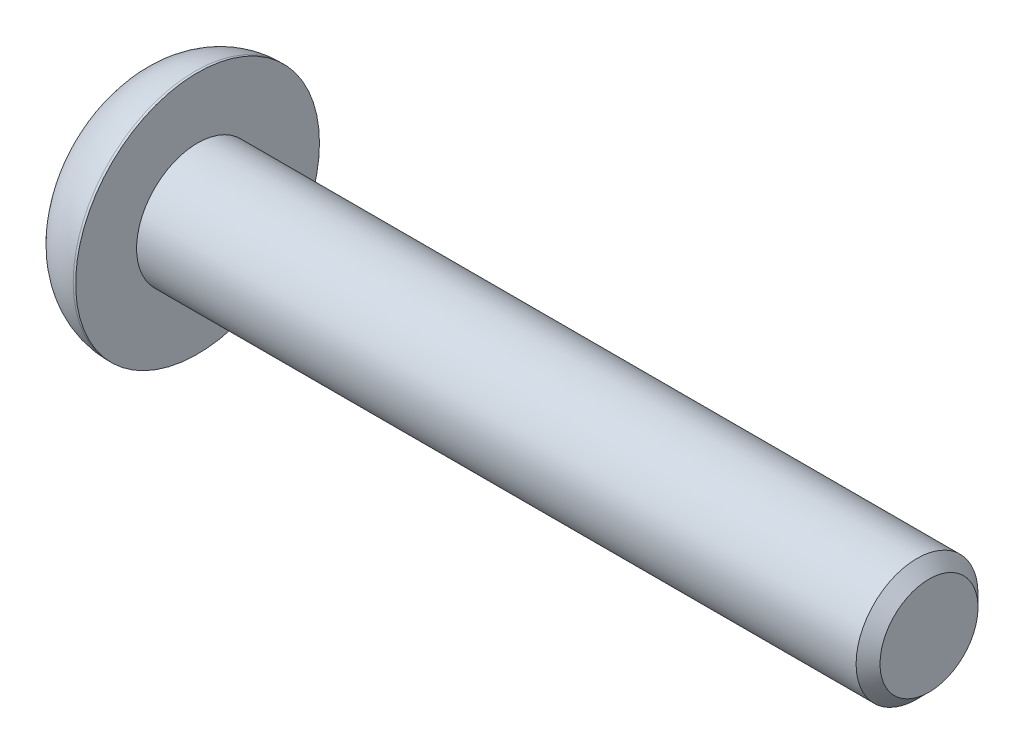
ISO-10303-21;
HEADER;
FILE_DESCRIPTION(('STEP AP214'),'2;1');
FILE_NAME('part.step','',(''),(''),'','','');
FILE_SCHEMA(('AUTOMOTIVE_DESIGN { 1 0 10303 214 1 1 1 1 }'));
ENDSEC;
DATA;
#1=APPLICATION_CONTEXT('core data for automotive mechanical design processes');
#2=APPLICATION_PROTOCOL_DEFINITION('international standard','automotive_design',2000,#1);
#3=PRODUCT_CONTEXT('',#1,'mechanical');
#4=PRODUCT('Part','Part','',(#3));
#5=PRODUCT_RELATED_PRODUCT_CATEGORY('part','',(#4));
#6=PRODUCT_DEFINITION_FORMATION('','',#4);
#7=PRODUCT_DEFINITION_CONTEXT('part definition',#1,'design');
#8=PRODUCT_DEFINITION('design','',#6,#7);
#9=PRODUCT_DEFINITION_SHAPE('','',#8);
#10=(LENGTH_UNIT() NAMED_UNIT(*) SI_UNIT(.MILLI.,.METRE.));
#11=(NAMED_UNIT(*) PLANE_ANGLE_UNIT() SI_UNIT($,.RADIAN.));
#12=(NAMED_UNIT(*) SI_UNIT($,.STERADIAN.) SOLID_ANGLE_UNIT());
#13=UNCERTAINTY_MEASURE_WITH_UNIT(LENGTH_MEASURE(1.E-05),#10,'distance_accuracy_value','');
#14=(GEOMETRIC_REPRESENTATION_CONTEXT(3) GLOBAL_UNCERTAINTY_ASSIGNED_CONTEXT((#13)) GLOBAL_UNIT_ASSIGNED_CONTEXT((#10,
#11,#12)) REPRESENTATION_CONTEXT('',''));
#15=CARTESIAN_POINT('',(0.,0.,0.));
#16=DIRECTION('',(0.,0.,1.));
#17=DIRECTION('',(1.,0.,0.));
#18=AXIS2_PLACEMENT_3D('',#15,#16,#17);
#19=CARTESIAN_POINT('',(1.93397459628386,0.,0.));
#20=DIRECTION('',(-1.,0.,0.));
#21=DIRECTION('',(0.,0.,1.));
#22=AXIS2_PLACEMENT_3D('',#19,#20,#21);
#23=CONICAL_SURFACE('',#22,1.499999999794,1.04719755099793);
#24=CARTESIAN_POINT('',(2.79999999995084,3.41060513164848E-10,0.));
#25=VERTEX_POINT('',#24);
#26=VERTEX_LOOP('',#25);
#27=FACE_BOUND('',#26,.T.);
#28=CARTESIAN_POINT('',(1.93397459621556,0.,0.));
#29=DIRECTION('',(1.,0.,0.));
#30=DIRECTION('',(0.,0.,-1.));
#31=AXIS2_PLACEMENT_3D('',#28,#29,#30);
#32=CIRCLE('',#31,1.5);
#33=CARTESIAN_POINT('',(1.93397459621556,0.,-1.5));
#34=VERTEX_POINT('',#33);
#35=EDGE_CURVE('E120',#34,#34,#32,.F.);
#36=ORIENTED_EDGE('',*,*,#35,.T.);
#37=EDGE_LOOP('',(#36));
#38=FACE_BOUND('',#37,.T.);
#39=ADVANCED_FACE('F16',(#27,#38),#23,.F.);
#40=CARTESIAN_POINT('',(0.966987298107781,0.,0.));
#41=DIRECTION('',(1.,0.,0.));
#42=DIRECTION('',(0.,0.,-1.));
#43=AXIS2_PLACEMENT_3D('',#40,#41,#42);
#44=CYLINDRICAL_SURFACE('',#43,1.5);
#45=ORIENTED_EDGE('',*,*,#35,.F.);
#46=EDGE_LOOP('',(#45));
#47=FACE_BOUND('',#46,.T.);
#48=CARTESIAN_POINT('',(1.82,0.,0.));
#49=DIRECTION('',(1.,0.,0.));
#50=DIRECTION('',(0.,0.,-1.));
#51=AXIS2_PLACEMENT_3D('',#48,#49,#50);
#52=CIRCLE('',#51,1.5);
#53=CARTESIAN_POINT('',(1.82,1.29903810567666,-0.75));
#54=VERTEX_POINT('',#53);
#55=CARTESIAN_POINT('',(1.82,1.29903810567666,0.749999999999999));
#56=VERTEX_POINT('',#55);
#57=EDGE_CURVE('E93',#54,#56,#52,.T.);
#58=ORIENTED_EDGE('',*,*,#57,.F.);
#59=CARTESIAN_POINT('',(1.82,0.,0.));
#60=DIRECTION('',(1.,0.,0.));
#61=DIRECTION('',(0.,0.,-1.));
#62=AXIS2_PLACEMENT_3D('',#59,#60,#61);
#63=CIRCLE('',#62,1.5);
#64=CARTESIAN_POINT('',(1.82,0.,-1.5));
#65=VERTEX_POINT('',#64);
#66=EDGE_CURVE('E101',#65,#54,#63,.T.);
#67=ORIENTED_EDGE('',*,*,#66,.F.);
#68=CARTESIAN_POINT('',(1.82,0.,0.));
#69=DIRECTION('',(1.,0.,0.));
#70=DIRECTION('',(0.,0.,-1.));
#71=AXIS2_PLACEMENT_3D('',#68,#69,#70);
#72=CIRCLE('',#71,1.5);
#73=CARTESIAN_POINT('',(1.82,-1.29903810567666,-0.749999999999999));
#74=VERTEX_POINT('',#73);
#75=EDGE_CURVE('E130',#65,#74,#72,.F.);
#76=ORIENTED_EDGE('',*,*,#75,.T.);
#77=CARTESIAN_POINT('',(1.82,0.,0.));
#78=DIRECTION('',(1.,0.,0.));
#79=DIRECTION('',(0.,0.,-1.));
#80=AXIS2_PLACEMENT_3D('',#77,#78,#79);
#81=CIRCLE('',#80,1.5);
#82=CARTESIAN_POINT('',(1.82,-1.29903810567666,0.750000000000001));
#83=VERTEX_POINT('',#82);
#84=EDGE_CURVE('E100',#74,#83,#81,.F.);
#85=ORIENTED_EDGE('',*,*,#84,.T.);
#86=CARTESIAN_POINT('',(1.82,0.,0.));
#87=DIRECTION('',(1.,0.,0.));
#88=DIRECTION('',(0.,0.,-1.));
#89=AXIS2_PLACEMENT_3D('',#86,#87,#88);
#90=CIRCLE('',#89,1.5);
#91=CARTESIAN_POINT('',(1.82,0.,1.5));
#92=VERTEX_POINT('',#91);
#93=EDGE_CURVE('E119',#92,#83,#90,.T.);
#94=ORIENTED_EDGE('',*,*,#93,.F.);
#95=CARTESIAN_POINT('',(1.82,0.,0.));
#96=DIRECTION('',(1.,0.,0.));
#97=DIRECTION('',(0.,0.,-1.));
#98=AXIS2_PLACEMENT_3D('',#95,#96,#97);
#99=CIRCLE('',#98,1.5);
#100=EDGE_CURVE('E19',#56,#92,#99,.T.);
#101=ORIENTED_EDGE('',*,*,#100,.F.);
#102=EDGE_LOOP('',(#58,#67,#76,#85,#94,#101));
#103=FACE_BOUND('',#102,.T.);
#104=ADVANCED_FACE('F117',(#47,#103),#44,.F.);
#105=CARTESIAN_POINT('',(1.82,0.,0.));
#106=DIRECTION('',(1.,0.,0.));
#107=DIRECTION('',(0.,0.,-1.));
#108=AXIS2_PLACEMENT_3D('',#105,#106,#107);
#109=PLANE('',#108);
#110=DIRECTION('',(0.,0.5,-0.866025403784439));
#111=VECTOR('',#110,1.);
#112=CARTESIAN_POINT('',(1.82,-0.866025403784439,-1.5));
#113=LINE('',#112,#111);
#114=CARTESIAN_POINT('',(1.82,-1.73205080756888,0.));
#115=VERTEX_POINT('',#114);
#116=EDGE_CURVE('E152',#74,#115,#113,.F.);
#117=ORIENTED_EDGE('',*,*,#116,.T.);
#118=DIRECTION('',(0.,-0.5,-0.866025403784439));
#119=VECTOR('',#118,1.);
#120=CARTESIAN_POINT('',(1.82,-1.73205080756888,0.));
#121=LINE('',#120,#119);
#122=EDGE_CURVE('E163',#115,#83,#121,.F.);
#123=ORIENTED_EDGE('',*,*,#122,.T.);
#124=ORIENTED_EDGE('',*,*,#84,.F.);
#125=EDGE_LOOP('',(#117,#123,#124));
#126=FACE_BOUND('',#125,.T.);
#127=ADVANCED_FACE('F414',(#126),#109,.F.);
#128=CARTESIAN_POINT('',(1.82,0.,0.));
#129=DIRECTION('',(1.,0.,0.));
#130=DIRECTION('',(0.,0.,-1.));
#131=AXIS2_PLACEMENT_3D('',#128,#129,#130);
#132=PLANE('',#131);
#133=DIRECTION('',(0.,1.,0.));
#134=VECTOR('',#133,1.);
#135=CARTESIAN_POINT('',(1.82,0.866025403784439,-1.5));
#136=LINE('',#135,#134);
#137=CARTESIAN_POINT('',(1.82,-0.866025403784439,-1.5));
#138=VERTEX_POINT('',#137);
#139=EDGE_CURVE('E173',#65,#138,#136,.F.);
#140=ORIENTED_EDGE('',*,*,#139,.T.);
#141=DIRECTION('',(0.,0.5,-0.866025403784439));
#142=VECTOR('',#141,1.);
#143=CARTESIAN_POINT('',(1.82,-0.866025403784439,-1.5));
#144=LINE('',#143,#142);
#145=EDGE_CURVE('E132',#138,#74,#144,.F.);
#146=ORIENTED_EDGE('',*,*,#145,.T.);
#147=ORIENTED_EDGE('',*,*,#75,.F.);
#148=EDGE_LOOP('',(#140,#146,#147));
#149=FACE_BOUND('',#148,.T.);
#150=ADVANCED_FACE('F404',(#149),#132,.F.);
#151=CARTESIAN_POINT('',(0.,-0.866025403784439,-1.5));
#152=DIRECTION('',(0.,-0.866025403784439,-0.5));
#153=DIRECTION('',(0.,0.5,-0.866025403784439));
#154=AXIS2_PLACEMENT_3D('',#151,#152,#153);
#155=PLANE('',#154);
#156=DIRECTION('',(1.,0.,0.));
#157=VECTOR('',#156,1.);
#158=CARTESIAN_POINT('',(0.,-1.73205080756888,0.));
#159=LINE('',#158,#157);
#160=CARTESIAN_POINT('',(0.,-1.73205080756888,0.));
#161=VERTEX_POINT('',#160);
#162=EDGE_CURVE('E158',#161,#115,#159,.T.);
#163=ORIENTED_EDGE('',*,*,#162,.T.);
#164=ORIENTED_EDGE('',*,*,#116,.F.);
#165=ORIENTED_EDGE('',*,*,#145,.F.);
#166=DIRECTION('',(-1.,0.,0.));
#167=VECTOR('',#166,1.);
#168=CARTESIAN_POINT('',(0.,-0.866025403784439,-1.5));
#169=LINE('',#168,#167);
#170=CARTESIAN_POINT('',(0.,-0.866025403784439,-1.5));
#171=VERTEX_POINT('',#170);
#172=EDGE_CURVE('E149',#138,#171,#169,.T.);
#173=ORIENTED_EDGE('',*,*,#172,.T.);
#174=DIRECTION('',(0.,0.5,-0.866025403784439));
#175=VECTOR('',#174,1.);
#176=CARTESIAN_POINT('',(0.,-0.866025403784439,-1.5));
#177=LINE('',#176,#175);
#178=EDGE_CURVE('E154',#161,#171,#177,.T.);
#179=ORIENTED_EDGE('',*,*,#178,.F.);
#180=EDGE_LOOP('',(#163,#164,#165,#173,#179));
#181=FACE_BOUND('',#180,.T.);
#182=ADVANCED_FACE('F394',(#181),#155,.F.);
#183=CARTESIAN_POINT('',(0.,-1.73205080756888,0.));
#184=DIRECTION('',(0.,-0.866025403784439,0.5));
#185=DIRECTION('',(0.,-0.5,-0.866025403784439));
#186=AXIS2_PLACEMENT_3D('',#183,#184,#185);
#187=PLANE('',#186);
#188=DIRECTION('',(1.,0.,0.));
#189=VECTOR('',#188,1.);
#190=CARTESIAN_POINT('',(0.,-0.866025403784439,1.5));
#191=LINE('',#190,#189);
#192=CARTESIAN_POINT('',(0.,-0.86602540378444,1.5));
#193=VERTEX_POINT('',#192);
#194=CARTESIAN_POINT('',(1.82,-0.866025403784439,1.5));
#195=VERTEX_POINT('',#194);
#196=EDGE_CURVE('E148',#193,#195,#191,.T.);
#197=ORIENTED_EDGE('',*,*,#196,.T.);
#198=DIRECTION('',(0.,-0.500000000000001,-0.866025403784438));
#199=VECTOR('',#198,1.);
#200=CARTESIAN_POINT('',(1.82,-0.866025403784439,1.5));
#201=LINE('',#200,#199);
#202=EDGE_CURVE('E186',#195,#83,#201,.T.);
#203=ORIENTED_EDGE('',*,*,#202,.T.);
#204=ORIENTED_EDGE('',*,*,#122,.F.);
#205=ORIENTED_EDGE('',*,*,#162,.F.);
#206=DIRECTION('',(0.,-0.5,-0.866025403784439));
#207=VECTOR('',#206,1.);
#208=CARTESIAN_POINT('',(0.,-1.73205080756888,0.));
#209=LINE('',#208,#207);
#210=EDGE_CURVE('E168',#193,#161,#209,.T.);
#211=ORIENTED_EDGE('',*,*,#210,.F.);
#212=EDGE_LOOP('',(#197,#203,#204,#205,#211));
#213=FACE_BOUND('',#212,.T.);
#214=ADVANCED_FACE('F385',(#213),#187,.F.);
#215=CARTESIAN_POINT('',(1.82,0.,0.));
#216=DIRECTION('',(1.,0.,0.));
#217=DIRECTION('',(0.,0.,-1.));
#218=AXIS2_PLACEMENT_3D('',#215,#216,#217);
#219=PLANE('',#218);
#220=ORIENTED_EDGE('',*,*,#202,.F.);
#221=DIRECTION('',(0.,1.,0.));
#222=VECTOR('',#221,1.);
#223=CARTESIAN_POINT('',(1.82,-0.866025403784439,1.5));
#224=LINE('',#223,#222);
#225=EDGE_CURVE('E193',#195,#92,#224,.T.);
#226=ORIENTED_EDGE('',*,*,#225,.T.);
#227=ORIENTED_EDGE('',*,*,#93,.T.);
#228=EDGE_LOOP('',(#220,#226,#227));
#229=FACE_BOUND('',#228,.T.);
#230=ADVANCED_FACE('F375',(#229),#219,.F.);
#231=CARTESIAN_POINT('',(1.82,0.,0.));
#232=DIRECTION('',(1.,0.,0.));
#233=DIRECTION('',(0.,0.,-1.));
#234=AXIS2_PLACEMENT_3D('',#231,#232,#233);
#235=PLANE('',#234);
#236=DIRECTION('',(0.,0.5,0.866025403784439));
#237=VECTOR('',#236,1.);
#238=CARTESIAN_POINT('',(1.82,1.73205080756888,0.));
#239=LINE('',#238,#237);
#240=CARTESIAN_POINT('',(1.82,0.866025403784441,-1.5));
#241=VERTEX_POINT('',#240);
#242=EDGE_CURVE('E203',#54,#241,#239,.F.);
#243=ORIENTED_EDGE('',*,*,#242,.T.);
#244=DIRECTION('',(0.,1.,0.));
#245=VECTOR('',#244,1.);
#246=CARTESIAN_POINT('',(1.82,0.866025403784439,-1.5));
#247=LINE('',#246,#245);
#248=EDGE_CURVE('E181',#241,#65,#247,.F.);
#249=ORIENTED_EDGE('',*,*,#248,.T.);
#250=ORIENTED_EDGE('',*,*,#66,.T.);
#251=EDGE_LOOP('',(#243,#249,#250));
#252=FACE_BOUND('',#251,.T.);
#253=ADVANCED_FACE('F365',(#252),#235,.F.);
#254=CARTESIAN_POINT('',(0.,0.866025403784439,-1.5));
#255=DIRECTION('',(0.,0.,-1.));
#256=DIRECTION('',(-1.,0.,0.));
#257=AXIS2_PLACEMENT_3D('',#254,#255,#256);
#258=PLANE('',#257);
#259=ORIENTED_EDGE('',*,*,#172,.F.);
#260=ORIENTED_EDGE('',*,*,#139,.F.);
#261=ORIENTED_EDGE('',*,*,#248,.F.);
#262=DIRECTION('',(1.,0.,0.));
#263=VECTOR('',#262,1.);
#264=CARTESIAN_POINT('',(0.,0.866025403784441,-1.5));
#265=LINE('',#264,#263);
#266=CARTESIAN_POINT('',(0.,0.86602540378444,-1.5));
#267=VERTEX_POINT('',#266);
#268=EDGE_CURVE('E200',#241,#267,#265,.F.);
#269=ORIENTED_EDGE('',*,*,#268,.T.);
#270=DIRECTION('',(0.,1.,0.));
#271=VECTOR('',#270,1.);
#272=CARTESIAN_POINT('',(0.,0.866025403784439,-1.5));
#273=LINE('',#272,#271);
#274=EDGE_CURVE('E146',#171,#267,#273,.T.);
#275=ORIENTED_EDGE('',*,*,#274,.F.);
#276=EDGE_LOOP('',(#259,#260,#261,#269,#275));
#277=FACE_BOUND('',#276,.T.);
#278=ADVANCED_FACE('F355',(#277),#258,.F.);
#279=CARTESIAN_POINT('',(0.,-0.866025403784439,1.5));
#280=DIRECTION('',(0.,0.,1.));
#281=DIRECTION('',(1.,0.,0.));
#282=AXIS2_PLACEMENT_3D('',#279,#280,#281);
#283=PLANE('',#282);
#284=DIRECTION('',(1.,0.,0.));
#285=VECTOR('',#284,1.);
#286=CARTESIAN_POINT('',(0.,0.866025403784439,1.5));
#287=LINE('',#286,#285);
#288=CARTESIAN_POINT('',(0.,0.866025403784439,1.5));
#289=VERTEX_POINT('',#288);
#290=CARTESIAN_POINT('',(1.82,0.866025403784439,1.5));
#291=VERTEX_POINT('',#290);
#292=EDGE_CURVE('E114',#289,#291,#287,.T.);
#293=ORIENTED_EDGE('',*,*,#292,.T.);
#294=DIRECTION('',(0.,1.,0.));
#295=VECTOR('',#294,1.);
#296=CARTESIAN_POINT('',(1.82,0.,1.5));
#297=LINE('',#296,#295);
#298=EDGE_CURVE('E113',#291,#92,#297,.F.);
#299=ORIENTED_EDGE('',*,*,#298,.T.);
#300=ORIENTED_EDGE('',*,*,#225,.F.);
#301=ORIENTED_EDGE('',*,*,#196,.F.);
#302=DIRECTION('',(0.,1.,0.));
#303=VECTOR('',#302,1.);
#304=CARTESIAN_POINT('',(0.,-0.866025403784439,1.5));
#305=LINE('',#304,#303);
#306=EDGE_CURVE('E197',#289,#193,#305,.F.);
#307=ORIENTED_EDGE('',*,*,#306,.F.);
#308=EDGE_LOOP('',(#293,#299,#300,#301,#307));
#309=FACE_BOUND('',#308,.T.);
#310=ADVANCED_FACE('F346',(#309),#283,.F.);
#311=CARTESIAN_POINT('',(1.82,0.,0.));
#312=DIRECTION('',(1.,0.,0.));
#313=DIRECTION('',(0.,0.,-1.));
#314=AXIS2_PLACEMENT_3D('',#311,#312,#313);
#315=PLANE('',#314);
#316=ORIENTED_EDGE('',*,*,#298,.F.);
#317=DIRECTION('',(0.,-0.5,0.866025403784439));
#318=VECTOR('',#317,1.);
#319=CARTESIAN_POINT('',(1.82,0.866025403784439,1.5));
#320=LINE('',#319,#318);
#321=EDGE_CURVE('E108',#291,#56,#320,.F.);
#322=ORIENTED_EDGE('',*,*,#321,.T.);
#323=ORIENTED_EDGE('',*,*,#100,.T.);
#324=EDGE_LOOP('',(#316,#322,#323));
#325=FACE_BOUND('',#324,.T.);
#326=ADVANCED_FACE('F112',(#325),#315,.F.);
#327=CARTESIAN_POINT('',(1.82,0.,0.));
#328=DIRECTION('',(1.,0.,0.));
#329=DIRECTION('',(0.,0.,-1.));
#330=AXIS2_PLACEMENT_3D('',#327,#328,#329);
#331=PLANE('',#330);
#332=DIRECTION('',(0.,-0.5,0.866025403784439));
#333=VECTOR('',#332,1.);
#334=CARTESIAN_POINT('',(1.82,0.866025403784439,1.5));
#335=LINE('',#334,#333);
#336=CARTESIAN_POINT('',(1.82,1.73205080756888,0.));
#337=VERTEX_POINT('',#336);
#338=EDGE_CURVE('E96',#56,#337,#335,.F.);
#339=ORIENTED_EDGE('',*,*,#338,.T.);
#340=DIRECTION('',(0.,0.5,0.866025403784439));
#341=VECTOR('',#340,1.);
#342=CARTESIAN_POINT('',(1.82,1.73205080756888,0.));
#343=LINE('',#342,#341);
#344=EDGE_CURVE('E98',#337,#54,#343,.F.);
#345=ORIENTED_EDGE('',*,*,#344,.T.);
#346=ORIENTED_EDGE('',*,*,#57,.T.);
#347=EDGE_LOOP('',(#339,#345,#346));
#348=FACE_BOUND('',#347,.T.);
#349=ADVANCED_FACE('F95',(#348),#331,.F.);
#350=CARTESIAN_POINT('',(0.,1.73205080756888,0.));
#351=DIRECTION('',(0.,0.866025403784439,-0.5));
#352=DIRECTION('',(0.,0.5,0.866025403784439));
#353=AXIS2_PLACEMENT_3D('',#350,#351,#352);
#354=PLANE('',#353);
#355=ORIENTED_EDGE('',*,*,#268,.F.);
#356=ORIENTED_EDGE('',*,*,#242,.F.);
#357=ORIENTED_EDGE('',*,*,#344,.F.);
#358=DIRECTION('',(1.,0.,0.));
#359=VECTOR('',#358,1.);
#360=CARTESIAN_POINT('',(0.,1.73205080756888,0.));
#361=LINE('',#360,#359);
#362=CARTESIAN_POINT('',(0.,1.73205080756888,0.));
#363=VERTEX_POINT('',#362);
#364=EDGE_CURVE('E110',#337,#363,#361,.F.);
#365=ORIENTED_EDGE('',*,*,#364,.T.);
#366=DIRECTION('',(0.,0.5,0.866025403784439));
#367=VECTOR('',#366,1.);
#368=CARTESIAN_POINT('',(0.,1.73205080756888,0.));
#369=LINE('',#368,#367);
#370=EDGE_CURVE('E34',#267,#363,#369,.T.);
#371=ORIENTED_EDGE('',*,*,#370,.F.);
#372=EDGE_LOOP('',(#355,#356,#357,#365,#371));
#373=FACE_BOUND('',#372,.T.);
#374=ADVANCED_FACE('F320',(#373),#354,.F.);
#375=CARTESIAN_POINT('',(0.,0.866025403784439,1.5));
#376=DIRECTION('',(0.,0.866025403784439,0.5));
#377=DIRECTION('',(0.,-0.5,0.866025403784439));
#378=AXIS2_PLACEMENT_3D('',#375,#376,#377);
#379=PLANE('',#378);
#380=ORIENTED_EDGE('',*,*,#364,.F.);
#381=ORIENTED_EDGE('',*,*,#338,.F.);
#382=ORIENTED_EDGE('',*,*,#321,.F.);
#383=ORIENTED_EDGE('',*,*,#292,.F.);
#384=DIRECTION('',(0.,-0.500000000000001,0.866025403784438));
#385=VECTOR('',#384,1.);
#386=CARTESIAN_POINT('',(0.,1.73205080756888,0.));
#387=LINE('',#386,#385);
#388=EDGE_CURVE('E137',#363,#289,#387,.T.);
#389=ORIENTED_EDGE('',*,*,#388,.F.);
#390=EDGE_LOOP('',(#380,#381,#382,#383,#389));
#391=FACE_BOUND('',#390,.T.);
#392=ADVANCED_FACE('F106',(#391),#379,.F.);
#393=CARTESIAN_POINT('',(0.,1.15,0.));
#394=DIRECTION('',(-1.,0.,0.));
#395=DIRECTION('',(0.,0.,1.));
#396=AXIS2_PLACEMENT_3D('',#393,#394,#395);
#397=PLANE('',#396);
#398=CARTESIAN_POINT('',(0.,0.,0.));
#399=DIRECTION('',(-1.,0.,0.));
#400=DIRECTION('',(0.,0.,1.));
#401=AXIS2_PLACEMENT_3D('',#398,#399,#400);
#402=CIRCLE('',#401,2.3);
#403=CARTESIAN_POINT('',(0.,0.,2.3));
#404=VERTEX_POINT('',#403);
#405=EDGE_CURVE('E133',#404,#404,#402,.F.);
#406=ORIENTED_EDGE('',*,*,#405,.F.);
#407=EDGE_LOOP('',(#406));
#408=FACE_BOUND('',#407,.T.);
#409=ORIENTED_EDGE('',*,*,#370,.T.);
#410=ORIENTED_EDGE('',*,*,#388,.T.);
#411=ORIENTED_EDGE('',*,*,#306,.T.);
#412=ORIENTED_EDGE('',*,*,#210,.T.);
#413=ORIENTED_EDGE('',*,*,#178,.T.);
#414=ORIENTED_EDGE('',*,*,#274,.T.);
#415=EDGE_LOOP('',(#409,#410,#411,#412,#413,#414));
#416=FACE_BOUND('',#415,.T.);
#417=ADVANCED_FACE('F301',(#408,#416),#397,.T.);
#418=CARTESIAN_POINT('',(2.7,0.,0.));
#419=DIRECTION('',(-1.,0.,0.));
#420=DIRECTION('',(0.,1.,0.));
#421=AXIS2_PLACEMENT_3D('',#418,#419,#420);
#422=DEGENERATE_TOROIDAL_SURFACE('',#421,2.3,2.7,.T.);
#423=ORIENTED_EDGE('',*,*,#405,.T.);
#424=EDGE_LOOP('',(#423));
#425=FACE_BOUND('',#424,.T.);
#426=CARTESIAN_POINT('',(2.7,0.,0.));
#427=DIRECTION('',(1.,0.,0.));
#428=DIRECTION('',(0.,0.,-1.));
#429=AXIS2_PLACEMENT_3D('',#426,#427,#428);
#430=CIRCLE('',#429,5.);
#431=CARTESIAN_POINT('',(2.7,0.,-5.));
#432=VERTEX_POINT('',#431);
#433=EDGE_CURVE('E136',#432,#432,#430,.T.);
#434=ORIENTED_EDGE('',*,*,#433,.F.);
#435=EDGE_LOOP('',(#434));
#436=FACE_BOUND('',#435,.T.);
#437=ADVANCED_FACE('F291',(#425,#436),#422,.T.);
#438=CARTESIAN_POINT('',(32.8,1.00475,0.));
#439=DIRECTION('',(1.,0.,0.));
#440=DIRECTION('',(0.,0.,-1.));
#441=AXIS2_PLACEMENT_3D('',#438,#439,#440);
#442=PLANE('',#441);
#443=CARTESIAN_POINT('',(32.799999999952,0.,0.));
#444=DIRECTION('',(-1.,0.,0.));
#445=DIRECTION('',(0.,0.,1.));
#446=AXIS2_PLACEMENT_3D('',#443,#444,#445);
#447=CIRCLE('',#446,2.00949999992872);
#448=CARTESIAN_POINT('',(32.799999999952,0.,2.00949999992872));
#449=VERTEX_POINT('',#448);
#450=EDGE_CURVE('E138',#449,#449,#447,.T.);
#451=ORIENTED_EDGE('',*,*,#450,.F.);
#452=EDGE_LOOP('',(#451));
#453=FACE_BOUND('',#452,.T.);
#454=ADVANCED_FACE('F256',(#453),#442,.T.);
#455=CARTESIAN_POINT('',(2.75,0.,0.));
#456=DIRECTION('',(1.,0.,0.));
#457=DIRECTION('',(0.,0.,-1.));
#458=AXIS2_PLACEMENT_3D('',#455,#456,#457);
#459=CYLINDRICAL_SURFACE('',#458,5.);
#460=ORIENTED_EDGE('',*,*,#433,.T.);
#461=EDGE_LOOP('',(#460));
#462=FACE_BOUND('',#461,.T.);
#463=CARTESIAN_POINT('',(2.8,0.,0.));
#464=DIRECTION('',(1.,0.,0.));
#465=DIRECTION('',(0.,0.,-1.));
#466=AXIS2_PLACEMENT_3D('',#463,#464,#465);
#467=CIRCLE('',#466,5.);
#468=CARTESIAN_POINT('',(2.8,0.,-5.));
#469=VERTEX_POINT('',#468);
#470=EDGE_CURVE('E141',#469,#469,#467,.T.);
#471=ORIENTED_EDGE('',*,*,#470,.F.);
#472=EDGE_LOOP('',(#471));
#473=FACE_BOUND('',#472,.T.);
#474=ADVANCED_FACE('F246',(#462,#473),#459,.T.);
#475=CARTESIAN_POINT('',(32.3094999999398,0.,0.));
#476=DIRECTION('',(-1.,0.,0.));
#477=DIRECTION('',(0.,0.,1.));
#478=AXIS2_PLACEMENT_3D('',#475,#476,#477);
#479=CONICAL_SURFACE('',#478,2.49999999999773,0.785398163455393);
#480=ORIENTED_EDGE('',*,*,#450,.T.);
#481=EDGE_LOOP('',(#480));
#482=FACE_BOUND('',#481,.T.);
#483=CARTESIAN_POINT('',(32.3095,0.,0.));
#484=DIRECTION('',(1.,0.,0.));
#485=DIRECTION('',(0.,0.,-1.));
#486=AXIS2_PLACEMENT_3D('',#483,#484,#485);
#487=CIRCLE('',#486,2.5);
#488=CARTESIAN_POINT('',(32.3095,0.,-2.5));
#489=VERTEX_POINT('',#488);
#490=EDGE_CURVE('E25',#489,#489,#487,.F.);
#491=ORIENTED_EDGE('',*,*,#490,.F.);
#492=EDGE_LOOP('',(#491));
#493=FACE_BOUND('',#492,.T.);
#494=ADVANCED_FACE('F243',(#482,#493),#479,.T.);
#495=CARTESIAN_POINT('',(2.8,3.75,0.));
#496=DIRECTION('',(1.,0.,0.));
#497=DIRECTION('',(0.,0.,-1.));
#498=AXIS2_PLACEMENT_3D('',#495,#496,#497);
#499=PLANE('',#498);
#500=CARTESIAN_POINT('',(2.8,0.,0.));
#501=DIRECTION('',(1.,0.,0.));
#502=DIRECTION('',(0.,0.,-1.));
#503=AXIS2_PLACEMENT_3D('',#500,#501,#502);
#504=CIRCLE('',#503,2.5);
#505=CARTESIAN_POINT('',(2.8,0.,-2.5));
#506=VERTEX_POINT('',#505);
#507=EDGE_CURVE('E11',#506,#506,#504,.T.);
#508=ORIENTED_EDGE('',*,*,#507,.F.);
#509=EDGE_LOOP('',(#508));
#510=FACE_BOUND('',#509,.T.);
#511=ORIENTED_EDGE('',*,*,#470,.T.);
#512=EDGE_LOOP('',(#511));
#513=FACE_BOUND('',#512,.T.);
#514=ADVANCED_FACE('F245',(#510,#513),#499,.T.);
#515=CARTESIAN_POINT('',(17.55475,0.,0.));
#516=DIRECTION('',(1.,0.,0.));
#517=DIRECTION('',(0.,0.,-1.));
#518=AXIS2_PLACEMENT_3D('',#515,#516,#517);
#519=CYLINDRICAL_SURFACE('',#518,2.5);
#520=ORIENTED_EDGE('',*,*,#490,.T.);
#521=EDGE_LOOP('',(#520));
#522=FACE_BOUND('',#521,.T.);
#523=ORIENTED_EDGE('',*,*,#507,.T.);
#524=EDGE_LOOP('',(#523));
#525=FACE_BOUND('',#524,.T.);
#526=ADVANCED_FACE('F240',(#522,#525),#519,.T.);
#527=CLOSED_SHELL('',(#39,#104,#127,#150,#182,#214,#230,#253,#278,#310,#326,#349,#374,#392,#417,
#437,#454,#474,#494,#514,#526));
#528=MANIFOLD_SOLID_BREP('B1',#527);
#529=ADVANCED_BREP_SHAPE_REPRESENTATION('',(#18,#528),#14);
#530=SHAPE_DEFINITION_REPRESENTATION(#9,#529);
ENDSEC;
END-ISO-10303-21;
